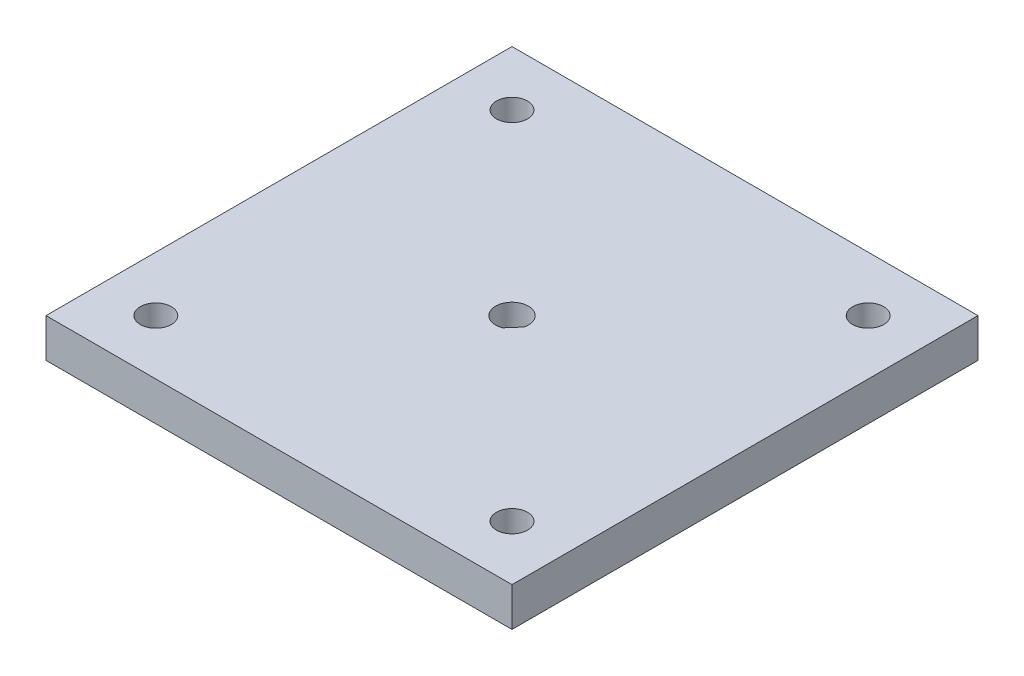
ISO-10303-21;
HEADER;
FILE_DESCRIPTION(('STEP AP214'),'2;1');
FILE_NAME('part.step','',(''),(''),'','','');
FILE_SCHEMA(('AUTOMOTIVE_DESIGN { 1 0 10303 214 1 1 1 1 }'));
ENDSEC;
DATA;
#1=APPLICATION_CONTEXT('core data for automotive mechanical design processes');
#2=APPLICATION_PROTOCOL_DEFINITION('international standard','automotive_design',2000,#1);
#3=PRODUCT_CONTEXT('',#1,'mechanical');
#4=PRODUCT('Part','Part','',(#3));
#5=PRODUCT_RELATED_PRODUCT_CATEGORY('part','',(#4));
#6=PRODUCT_DEFINITION_FORMATION('','',#4);
#7=PRODUCT_DEFINITION_CONTEXT('part definition',#1,'design');
#8=PRODUCT_DEFINITION('design','',#6,#7);
#9=PRODUCT_DEFINITION_SHAPE('','',#8);
#10=(LENGTH_UNIT() NAMED_UNIT(*) SI_UNIT(.MILLI.,.METRE.));
#11=(NAMED_UNIT(*) PLANE_ANGLE_UNIT() SI_UNIT($,.RADIAN.));
#12=(NAMED_UNIT(*) SI_UNIT($,.STERADIAN.) SOLID_ANGLE_UNIT());
#13=UNCERTAINTY_MEASURE_WITH_UNIT(LENGTH_MEASURE(1.E-05),#10,'distance_accuracy_value','');
#14=(GEOMETRIC_REPRESENTATION_CONTEXT(3) GLOBAL_UNCERTAINTY_ASSIGNED_CONTEXT((#13)) GLOBAL_UNIT_ASSIGNED_CONTEXT((#10,
#11,#12)) REPRESENTATION_CONTEXT('',''));
#15=CARTESIAN_POINT('',(0.,0.,0.));
#16=DIRECTION('',(0.,0.,1.));
#17=DIRECTION('',(1.,0.,0.));
#18=AXIS2_PLACEMENT_3D('',#15,#16,#17);
#19=CARTESIAN_POINT('',(0.,6.35,-38.1));
#20=DIRECTION('',(0.,0.,1.));
#21=DIRECTION('',(1.,0.,0.));
#22=AXIS2_PLACEMENT_3D('',#19,#20,#21);
#23=PLANE('',#22);
#24=DIRECTION('',(-1.,0.,0.));
#25=VECTOR('',#24,1.);
#26=CARTESIAN_POINT('',(0.,0.,-38.1));
#27=LINE('',#26,#25);
#28=CARTESIAN_POINT('',(38.1,0.,-38.1));
#29=VERTEX_POINT('',#28);
#30=CARTESIAN_POINT('',(-38.1,0.,-38.1));
#31=VERTEX_POINT('',#30);
#32=EDGE_CURVE('E160',#29,#31,#27,.T.);
#33=ORIENTED_EDGE('',*,*,#32,.T.);
#34=DIRECTION('',(0.,-1.,0.));
#35=VECTOR('',#34,1.);
#36=CARTESIAN_POINT('',(-38.1,6.35,-38.1));
#37=LINE('',#36,#35);
#38=CARTESIAN_POINT('',(-38.1,6.35,-38.1));
#39=VERTEX_POINT('',#38);
#40=EDGE_CURVE('E11',#39,#31,#37,.T.);
#41=ORIENTED_EDGE('',*,*,#40,.F.);
#42=DIRECTION('',(-1.,0.,0.));
#43=VECTOR('',#42,1.);
#44=CARTESIAN_POINT('',(0.,6.35,-38.1));
#45=LINE('',#44,#43);
#46=CARTESIAN_POINT('',(38.1,6.35,-38.1));
#47=VERTEX_POINT('',#46);
#48=EDGE_CURVE('E115',#47,#39,#45,.T.);
#49=ORIENTED_EDGE('',*,*,#48,.F.);
#50=DIRECTION('',(0.,-1.,0.));
#51=VECTOR('',#50,1.);
#52=CARTESIAN_POINT('',(38.1,6.35,-38.1));
#53=LINE('',#52,#51);
#54=EDGE_CURVE('E67',#47,#29,#53,.T.);
#55=ORIENTED_EDGE('',*,*,#54,.T.);
#56=EDGE_LOOP('',(#33,#41,#49,#55));
#57=FACE_BOUND('',#56,.T.);
#58=ADVANCED_FACE('F47',(#57),#23,.F.);
#59=CARTESIAN_POINT('',(-38.1,6.35,0.));
#60=DIRECTION('',(1.,0.,0.));
#61=DIRECTION('',(0.,0.,-1.));
#62=AXIS2_PLACEMENT_3D('',#59,#60,#61);
#63=PLANE('',#62);
#64=DIRECTION('',(0.,0.,1.));
#65=VECTOR('',#64,1.);
#66=CARTESIAN_POINT('',(-38.1,0.,0.));
#67=LINE('',#66,#65);
#68=CARTESIAN_POINT('',(-38.1,0.,38.1));
#69=VERTEX_POINT('',#68);
#70=EDGE_CURVE('E122',#31,#69,#67,.T.);
#71=ORIENTED_EDGE('',*,*,#70,.T.);
#72=DIRECTION('',(0.,-1.,0.));
#73=VECTOR('',#72,1.);
#74=CARTESIAN_POINT('',(-38.1,6.35,38.1));
#75=LINE('',#74,#73);
#76=CARTESIAN_POINT('',(-38.1,6.35,38.1));
#77=VERTEX_POINT('',#76);
#78=EDGE_CURVE('E58',#77,#69,#75,.T.);
#79=ORIENTED_EDGE('',*,*,#78,.F.);
#80=DIRECTION('',(0.,0.,1.));
#81=VECTOR('',#80,1.);
#82=CARTESIAN_POINT('',(-38.1,6.35,0.));
#83=LINE('',#82,#81);
#84=EDGE_CURVE('E109',#39,#77,#83,.T.);
#85=ORIENTED_EDGE('',*,*,#84,.F.);
#86=ORIENTED_EDGE('',*,*,#40,.T.);
#87=EDGE_LOOP('',(#71,#79,#85,#86));
#88=FACE_BOUND('',#87,.T.);
#89=ADVANCED_FACE('F121',(#88),#63,.F.);
#90=CARTESIAN_POINT('',(0.,6.35,38.1));
#91=DIRECTION('',(0.,0.,1.));
#92=DIRECTION('',(1.,0.,0.));
#93=AXIS2_PLACEMENT_3D('',#90,#91,#92);
#94=PLANE('',#93);
#95=DIRECTION('',(-1.,0.,0.));
#96=VECTOR('',#95,1.);
#97=CARTESIAN_POINT('',(0.,0.,38.1));
#98=LINE('',#97,#96);
#99=CARTESIAN_POINT('',(38.1,0.,38.1));
#100=VERTEX_POINT('',#99);
#101=EDGE_CURVE('E165',#100,#69,#98,.T.);
#102=ORIENTED_EDGE('',*,*,#101,.F.);
#103=DIRECTION('',(0.,-1.,0.));
#104=VECTOR('',#103,1.);
#105=CARTESIAN_POINT('',(38.1,6.35,38.1));
#106=LINE('',#105,#104);
#107=CARTESIAN_POINT('',(38.1,6.35,38.1));
#108=VERTEX_POINT('',#107);
#109=EDGE_CURVE('E87',#108,#100,#106,.T.);
#110=ORIENTED_EDGE('',*,*,#109,.F.);
#111=DIRECTION('',(-1.,0.,0.));
#112=VECTOR('',#111,1.);
#113=CARTESIAN_POINT('',(0.,6.35,38.1));
#114=LINE('',#113,#112);
#115=EDGE_CURVE('E114',#108,#77,#114,.T.);
#116=ORIENTED_EDGE('',*,*,#115,.T.);
#117=ORIENTED_EDGE('',*,*,#78,.T.);
#118=EDGE_LOOP('',(#102,#110,#116,#117));
#119=FACE_BOUND('',#118,.T.);
#120=ADVANCED_FACE('F127',(#119),#94,.T.);
#121=CARTESIAN_POINT('',(0.,6.35,0.));
#122=DIRECTION('',(0.,-1.,0.));
#123=DIRECTION('',(0.,0.,-1.));
#124=AXIS2_PLACEMENT_3D('',#121,#122,#123);
#125=CYLINDRICAL_SURFACE('',#124,2.68309453522549);
#126=CARTESIAN_POINT('',(0.,0.,0.));
#127=DIRECTION('',(0.,1.,0.));
#128=DIRECTION('',(0.,0.,1.));
#129=AXIS2_PLACEMENT_3D('',#126,#127,#128);
#130=CIRCLE('',#129,2.68309453522549);
#131=CARTESIAN_POINT('',(2.60910557545117,0.,0.625751053619995));
#132=VERTEX_POINT('',#131);
#133=CARTESIAN_POINT('',(0.975970434044576,0.,2.49929550010153));
#134=VERTEX_POINT('',#133);
#135=EDGE_CURVE('E152',#132,#134,#130,.T.);
#136=ORIENTED_EDGE('',*,*,#135,.F.);
#137=DIRECTION('',(0.,-1.,0.));
#138=VECTOR('',#137,1.);
#139=CARTESIAN_POINT('',(2.60910557545117,6.35,0.625751053619995));
#140=LINE('',#139,#138);
#141=CARTESIAN_POINT('',(2.60910557545117,6.35,0.625751053619995));
#142=VERTEX_POINT('',#141);
#143=EDGE_CURVE('E51',#142,#132,#140,.T.);
#144=ORIENTED_EDGE('',*,*,#143,.F.);
#145=CARTESIAN_POINT('',(0.,6.35,0.));
#146=DIRECTION('',(0.,1.,0.));
#147=DIRECTION('',(0.,0.,1.));
#148=AXIS2_PLACEMENT_3D('',#145,#146,#147);
#149=CIRCLE('',#148,2.68309453522549);
#150=CARTESIAN_POINT('',(0.975970434044576,6.35,2.49929550010153));
#151=VERTEX_POINT('',#150);
#152=EDGE_CURVE('E252',#142,#151,#149,.T.);
#153=ORIENTED_EDGE('',*,*,#152,.T.);
#154=DIRECTION('',(0.,-1.,0.));
#155=VECTOR('',#154,1.);
#156=CARTESIAN_POINT('',(0.975970434044576,6.35,2.49929550010153));
#157=LINE('',#156,#155);
#158=EDGE_CURVE('E132',#151,#134,#157,.T.);
#159=ORIENTED_EDGE('',*,*,#158,.T.);
#160=EDGE_LOOP('',(#136,#144,#153,#159));
#161=FACE_BOUND('',#160,.T.);
#162=ADVANCED_FACE('F184',(#161),#125,.F.);
#163=CARTESIAN_POINT('',(1.79253800474787,6.35,1.56252327686076));
#164=DIRECTION('',(-0.753814839162269,0.,-0.657086895515929));
#165=DIRECTION('',(-0.657086895515929,0.,0.753814839162269));
#166=AXIS2_PLACEMENT_3D('',#163,#164,#165);
#167=PLANE('',#166);
#168=DIRECTION('',(0.657086895515929,0.,-0.753814839162269));
#169=VECTOR('',#168,1.);
#170=CARTESIAN_POINT('',(1.79253800474787,0.,1.56252327686076));
#171=LINE('',#170,#169);
#172=EDGE_CURVE('E156',#134,#132,#171,.T.);
#173=ORIENTED_EDGE('',*,*,#172,.F.);
#174=ORIENTED_EDGE('',*,*,#158,.F.);
#175=DIRECTION('',(0.657086895515929,0.,-0.753814839162269));
#176=VECTOR('',#175,1.);
#177=CARTESIAN_POINT('',(1.79253800474787,6.35,1.56252327686076));
#178=LINE('',#177,#176);
#179=EDGE_CURVE('E183',#151,#142,#178,.T.);
#180=ORIENTED_EDGE('',*,*,#179,.T.);
#181=ORIENTED_EDGE('',*,*,#143,.T.);
#182=EDGE_LOOP('',(#173,#174,#180,#181));
#183=FACE_BOUND('',#182,.T.);
#184=ADVANCED_FACE('F181',(#183),#167,.T.);
#185=CARTESIAN_POINT('',(-29.1204181438481,6.35,-29.1204181438481));
#186=DIRECTION('',(0.,-1.,0.));
#187=DIRECTION('',(0.,0.,-1.));
#188=AXIS2_PLACEMENT_3D('',#185,#186,#187);
#189=CYLINDRICAL_SURFACE('',#188,2.54);
#190=CARTESIAN_POINT('',(-29.1204181438481,6.35,-29.1204181438481));
#191=DIRECTION('',(0.,1.,0.));
#192=DIRECTION('',(0.,0.,1.));
#193=AXIS2_PLACEMENT_3D('',#190,#191,#192);
#194=CIRCLE('',#193,2.54);
#195=CARTESIAN_POINT('',(-29.1204181438481,6.35,-26.5804181438481));
#196=VERTEX_POINT('',#195);
#197=EDGE_CURVE('E244',#196,#196,#194,.T.);
#198=ORIENTED_EDGE('',*,*,#197,.T.);
#199=EDGE_LOOP('',(#198));
#200=FACE_BOUND('',#199,.T.);
#201=CARTESIAN_POINT('',(-29.1204181438481,0.,-29.1204181438481));
#202=DIRECTION('',(0.,1.,0.));
#203=DIRECTION('',(0.,0.,1.));
#204=AXIS2_PLACEMENT_3D('',#201,#202,#203);
#205=CIRCLE('',#204,2.54);
#206=CARTESIAN_POINT('',(-29.1204181438481,0.,-26.5804181438481));
#207=VERTEX_POINT('',#206);
#208=EDGE_CURVE('E148',#207,#207,#205,.T.);
#209=ORIENTED_EDGE('',*,*,#208,.F.);
#210=EDGE_LOOP('',(#209));
#211=FACE_BOUND('',#210,.T.);
#212=ADVANCED_FACE('F212',(#200,#211),#189,.F.);
#213=CARTESIAN_POINT('',(29.1204181438481,6.35,-29.1204181438481));
#214=DIRECTION('',(0.,-1.,0.));
#215=DIRECTION('',(0.,0.,-1.));
#216=AXIS2_PLACEMENT_3D('',#213,#214,#215);
#217=CYLINDRICAL_SURFACE('',#216,2.54);
#218=CARTESIAN_POINT('',(29.1204181438481,6.35,-29.1204181438481));
#219=DIRECTION('',(0.,1.,0.));
#220=DIRECTION('',(0.,0.,1.));
#221=AXIS2_PLACEMENT_3D('',#218,#219,#220);
#222=CIRCLE('',#221,2.54);
#223=CARTESIAN_POINT('',(29.1204181438481,6.35,-26.5804181438481));
#224=VERTEX_POINT('',#223);
#225=EDGE_CURVE('E239',#224,#224,#222,.T.);
#226=ORIENTED_EDGE('',*,*,#225,.T.);
#227=EDGE_LOOP('',(#226));
#228=FACE_BOUND('',#227,.T.);
#229=CARTESIAN_POINT('',(29.1204181438481,0.,-29.1204181438481));
#230=DIRECTION('',(0.,1.,0.));
#231=DIRECTION('',(0.,0.,1.));
#232=AXIS2_PLACEMENT_3D('',#229,#230,#231);
#233=CIRCLE('',#232,2.54);
#234=CARTESIAN_POINT('',(29.1204181438481,0.,-26.5804181438481));
#235=VERTEX_POINT('',#234);
#236=EDGE_CURVE('E144',#235,#235,#233,.T.);
#237=ORIENTED_EDGE('',*,*,#236,.F.);
#238=EDGE_LOOP('',(#237));
#239=FACE_BOUND('',#238,.T.);
#240=ADVANCED_FACE('F217',(#228,#239),#217,.F.);
#241=CARTESIAN_POINT('',(29.1204181438481,6.35,29.1204181438481));
#242=DIRECTION('',(0.,-1.,0.));
#243=DIRECTION('',(0.,0.,-1.));
#244=AXIS2_PLACEMENT_3D('',#241,#242,#243);
#245=CYLINDRICAL_SURFACE('',#244,2.54);
#246=CARTESIAN_POINT('',(29.1204181438481,6.35,29.1204181438481));
#247=DIRECTION('',(0.,1.,0.));
#248=DIRECTION('',(0.,0.,1.));
#249=AXIS2_PLACEMENT_3D('',#246,#247,#248);
#250=CIRCLE('',#249,2.54);
#251=CARTESIAN_POINT('',(29.1204181438481,6.35,31.6604181438481));
#252=VERTEX_POINT('',#251);
#253=EDGE_CURVE('E228',#252,#252,#250,.T.);
#254=ORIENTED_EDGE('',*,*,#253,.T.);
#255=EDGE_LOOP('',(#254));
#256=FACE_BOUND('',#255,.T.);
#257=CARTESIAN_POINT('',(29.1204181438481,0.,29.1204181438481));
#258=DIRECTION('',(0.,1.,0.));
#259=DIRECTION('',(0.,0.,1.));
#260=AXIS2_PLACEMENT_3D('',#257,#258,#259);
#261=CIRCLE('',#260,2.54);
#262=CARTESIAN_POINT('',(29.1204181438481,0.,31.6604181438481));
#263=VERTEX_POINT('',#262);
#264=EDGE_CURVE('E140',#263,#263,#261,.T.);
#265=ORIENTED_EDGE('',*,*,#264,.F.);
#266=EDGE_LOOP('',(#265));
#267=FACE_BOUND('',#266,.T.);
#268=ADVANCED_FACE('F200',(#256,#267),#245,.F.);
#269=CARTESIAN_POINT('',(-29.1204181438481,6.35,29.1204181438481));
#270=DIRECTION('',(0.,-1.,0.));
#271=DIRECTION('',(0.,0.,-1.));
#272=AXIS2_PLACEMENT_3D('',#269,#270,#271);
#273=CYLINDRICAL_SURFACE('',#272,2.54);
#274=CARTESIAN_POINT('',(-29.1204181438481,6.35,29.1204181438481));
#275=DIRECTION('',(0.,1.,0.));
#276=DIRECTION('',(0.,0.,1.));
#277=AXIS2_PLACEMENT_3D('',#274,#275,#276);
#278=CIRCLE('',#277,2.54);
#279=CARTESIAN_POINT('',(-29.1204181438481,6.35,31.6604181438481));
#280=VERTEX_POINT('',#279);
#281=EDGE_CURVE('E172',#280,#280,#278,.T.);
#282=ORIENTED_EDGE('',*,*,#281,.T.);
#283=EDGE_LOOP('',(#282));
#284=FACE_BOUND('',#283,.T.);
#285=CARTESIAN_POINT('',(-29.1204181438481,0.,29.1204181438481));
#286=DIRECTION('',(0.,1.,0.));
#287=DIRECTION('',(0.,0.,1.));
#288=AXIS2_PLACEMENT_3D('',#285,#286,#287);
#289=CIRCLE('',#288,2.54);
#290=CARTESIAN_POINT('',(-29.1204181438481,0.,31.6604181438481));
#291=VERTEX_POINT('',#290);
#292=EDGE_CURVE('E136',#291,#291,#289,.T.);
#293=ORIENTED_EDGE('',*,*,#292,.F.);
#294=EDGE_LOOP('',(#293));
#295=FACE_BOUND('',#294,.T.);
#296=ADVANCED_FACE('F49',(#284,#295),#273,.F.);
#297=CARTESIAN_POINT('',(38.1,6.35,0.));
#298=DIRECTION('',(1.,0.,0.));
#299=DIRECTION('',(0.,0.,-1.));
#300=AXIS2_PLACEMENT_3D('',#297,#298,#299);
#301=PLANE('',#300);
#302=DIRECTION('',(0.,0.,1.));
#303=VECTOR('',#302,1.);
#304=CARTESIAN_POINT('',(38.1,0.,0.));
#305=LINE('',#304,#303);
#306=EDGE_CURVE('E168',#29,#100,#305,.T.);
#307=ORIENTED_EDGE('',*,*,#306,.F.);
#308=ORIENTED_EDGE('',*,*,#54,.F.);
#309=DIRECTION('',(0.,0.,1.));
#310=VECTOR('',#309,1.);
#311=CARTESIAN_POINT('',(38.1,6.35,0.));
#312=LINE('',#311,#310);
#313=EDGE_CURVE('E129',#47,#108,#312,.T.);
#314=ORIENTED_EDGE('',*,*,#313,.T.);
#315=ORIENTED_EDGE('',*,*,#109,.T.);
#316=EDGE_LOOP('',(#307,#308,#314,#315));
#317=FACE_BOUND('',#316,.T.);
#318=ADVANCED_FACE('F191',(#317),#301,.T.);
#319=CARTESIAN_POINT('',(0.,6.35,0.));
#320=DIRECTION('',(0.,1.,0.));
#321=DIRECTION('',(0.,0.,1.));
#322=AXIS2_PLACEMENT_3D('',#319,#320,#321);
#323=PLANE('',#322);
#324=ORIENTED_EDGE('',*,*,#281,.F.);
#325=EDGE_LOOP('',(#324));
#326=FACE_BOUND('',#325,.T.);
#327=ORIENTED_EDGE('',*,*,#253,.F.);
#328=EDGE_LOOP('',(#327));
#329=FACE_BOUND('',#328,.T.);
#330=ORIENTED_EDGE('',*,*,#225,.F.);
#331=EDGE_LOOP('',(#330));
#332=FACE_BOUND('',#331,.T.);
#333=ORIENTED_EDGE('',*,*,#197,.F.);
#334=EDGE_LOOP('',(#333));
#335=FACE_BOUND('',#334,.T.);
#336=ORIENTED_EDGE('',*,*,#152,.F.);
#337=ORIENTED_EDGE('',*,*,#179,.F.);
#338=EDGE_LOOP('',(#336,#337));
#339=FACE_BOUND('',#338,.T.);
#340=ORIENTED_EDGE('',*,*,#48,.T.);
#341=ORIENTED_EDGE('',*,*,#84,.T.);
#342=ORIENTED_EDGE('',*,*,#115,.F.);
#343=ORIENTED_EDGE('',*,*,#313,.F.);
#344=EDGE_LOOP('',(#340,#341,#342,#343));
#345=FACE_BOUND('',#344,.T.);
#346=ADVANCED_FACE('F111',(#326,#329,#332,#335,#339,#345),#323,.T.);
#347=CARTESIAN_POINT('',(0.,0.,0.));
#348=DIRECTION('',(0.,1.,0.));
#349=DIRECTION('',(0.,0.,1.));
#350=AXIS2_PLACEMENT_3D('',#347,#348,#349);
#351=PLANE('',#350);
#352=ORIENTED_EDGE('',*,*,#292,.T.);
#353=EDGE_LOOP('',(#352));
#354=FACE_BOUND('',#353,.T.);
#355=ORIENTED_EDGE('',*,*,#264,.T.);
#356=EDGE_LOOP('',(#355));
#357=FACE_BOUND('',#356,.T.);
#358=ORIENTED_EDGE('',*,*,#236,.T.);
#359=EDGE_LOOP('',(#358));
#360=FACE_BOUND('',#359,.T.);
#361=ORIENTED_EDGE('',*,*,#208,.T.);
#362=EDGE_LOOP('',(#361));
#363=FACE_BOUND('',#362,.T.);
#364=ORIENTED_EDGE('',*,*,#135,.T.);
#365=ORIENTED_EDGE('',*,*,#172,.T.);
#366=EDGE_LOOP('',(#364,#365));
#367=FACE_BOUND('',#366,.T.);
#368=ORIENTED_EDGE('',*,*,#32,.F.);
#369=ORIENTED_EDGE('',*,*,#306,.T.);
#370=ORIENTED_EDGE('',*,*,#101,.T.);
#371=ORIENTED_EDGE('',*,*,#70,.F.);
#372=EDGE_LOOP('',(#368,#369,#370,#371));
#373=FACE_BOUND('',#372,.T.);
#374=ADVANCED_FACE('F186',(#354,#357,#360,#363,#367,#373),#351,.F.);
#375=CLOSED_SHELL('',(#58,#89,#120,#162,#184,#212,#240,#268,#296,#318,#346,#374));
#376=MANIFOLD_SOLID_BREP('B2',#375);
#377=ADVANCED_BREP_SHAPE_REPRESENTATION('',(#18,#376),#14);
#378=SHAPE_DEFINITION_REPRESENTATION(#9,#377);
ENDSEC;
END-ISO-10303-21;
